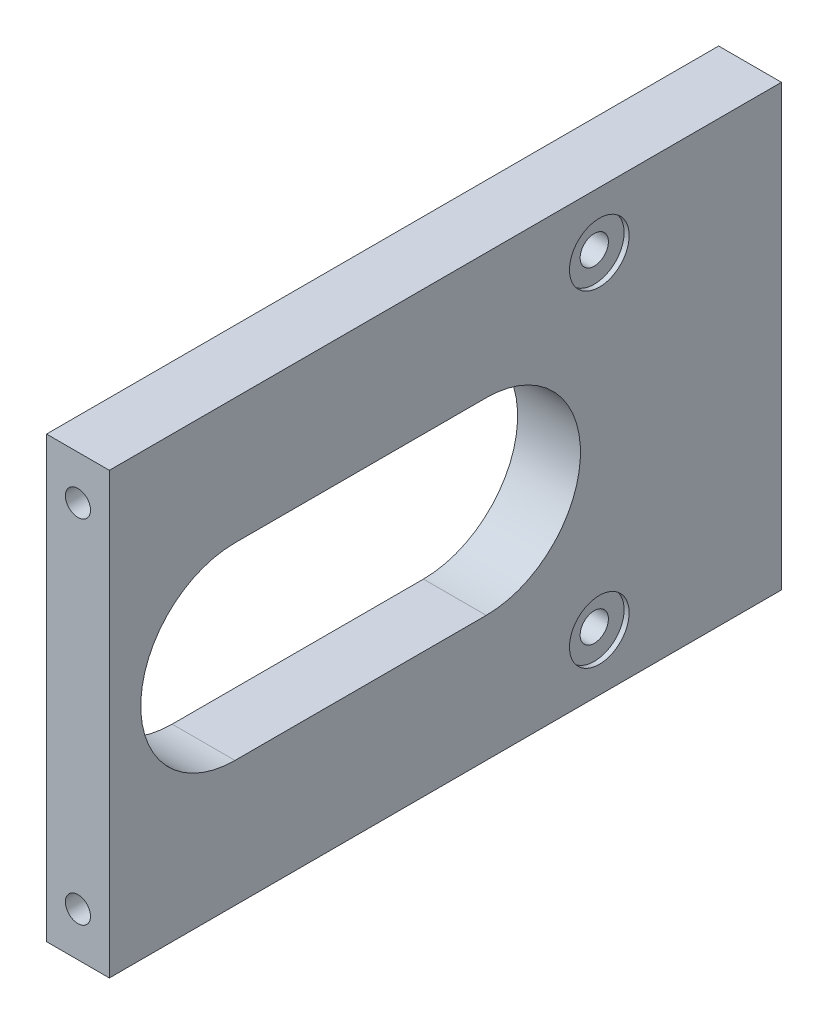
ISO-10303-21;
HEADER;
FILE_DESCRIPTION(('STEP AP214'),'2;1');
FILE_NAME('part.step','',(''),(''),'','','');
FILE_SCHEMA(('AUTOMOTIVE_DESIGN { 1 0 10303 214 1 1 1 1 }'));
ENDSEC;
DATA;
#1=APPLICATION_CONTEXT('core data for automotive mechanical design processes');
#2=APPLICATION_PROTOCOL_DEFINITION('international standard','automotive_design',2000,#1);
#3=PRODUCT_CONTEXT('',#1,'mechanical');
#4=PRODUCT('Part','Part','',(#3));
#5=PRODUCT_RELATED_PRODUCT_CATEGORY('part','',(#4));
#6=PRODUCT_DEFINITION_FORMATION('','',#4);
#7=PRODUCT_DEFINITION_CONTEXT('part definition',#1,'design');
#8=PRODUCT_DEFINITION('design','',#6,#7);
#9=PRODUCT_DEFINITION_SHAPE('','',#8);
#10=(LENGTH_UNIT() NAMED_UNIT(*) SI_UNIT(.MILLI.,.METRE.));
#11=(NAMED_UNIT(*) PLANE_ANGLE_UNIT() SI_UNIT($,.RADIAN.));
#12=(NAMED_UNIT(*) SI_UNIT($,.STERADIAN.) SOLID_ANGLE_UNIT());
#13=UNCERTAINTY_MEASURE_WITH_UNIT(LENGTH_MEASURE(1.E-05),#10,'distance_accuracy_value','');
#14=(GEOMETRIC_REPRESENTATION_CONTEXT(3) GLOBAL_UNCERTAINTY_ASSIGNED_CONTEXT((#13)) GLOBAL_UNIT_ASSIGNED_CONTEXT((#10,
#11,#12)) REPRESENTATION_CONTEXT('',''));
#15=CARTESIAN_POINT('',(0.,0.,0.));
#16=DIRECTION('',(0.,0.,1.));
#17=DIRECTION('',(1.,0.,0.));
#18=AXIS2_PLACEMENT_3D('',#15,#16,#17);
#19=CARTESIAN_POINT('',(5.0105,7.,12.0014));
#20=DIRECTION('',(0.,0.,1.));
#21=DIRECTION('',(1.,0.,0.));
#22=AXIS2_PLACEMENT_3D('',#19,#20,#21);
#23=PLANE('',#22);
#24=CARTESIAN_POINT('',(5.0105,7.,12.0014));
#25=DIRECTION('',(0.,0.,1.));
#26=DIRECTION('',(1.,0.,0.));
#27=AXIS2_PLACEMENT_3D('',#24,#25,#26);
#28=CIRCLE('',#27,2.);
#29=CARTESIAN_POINT('',(7.0105,7.,12.0014));
#30=VERTEX_POINT('',#29);
#31=EDGE_CURVE('E19',#30,#30,#28,.F.);
#32=ORIENTED_EDGE('',*,*,#31,.T.);
#33=EDGE_LOOP('',(#32));
#34=FACE_BOUND('',#33,.T.);
#35=ADVANCED_FACE('F16',(#34),#23,.F.);
#36=CARTESIAN_POINT('',(5.0105,63.,12.0014));
#37=DIRECTION('',(0.,0.,1.));
#38=DIRECTION('',(1.,0.,0.));
#39=AXIS2_PLACEMENT_3D('',#36,#37,#38);
#40=PLANE('',#39);
#41=CARTESIAN_POINT('',(5.0105,63.,12.0014));
#42=DIRECTION('',(0.,0.,1.));
#43=DIRECTION('',(1.,0.,0.));
#44=AXIS2_PLACEMENT_3D('',#41,#42,#43);
#45=CIRCLE('',#44,2.);
#46=CARTESIAN_POINT('',(7.0105,63.,12.0014));
#47=VERTEX_POINT('',#46);
#48=EDGE_CURVE('E170',#47,#47,#45,.F.);
#49=ORIENTED_EDGE('',*,*,#48,.T.);
#50=EDGE_LOOP('',(#49));
#51=FACE_BOUND('',#50,.T.);
#52=ADVANCED_FACE('F265',(#51),#40,.F.);
#53=CARTESIAN_POINT('',(5.0105,7.,95.0014));
#54=DIRECTION('',(0.,0.,-1.));
#55=DIRECTION('',(-1.,0.,0.));
#56=AXIS2_PLACEMENT_3D('',#53,#54,#55);
#57=PLANE('',#56);
#58=CARTESIAN_POINT('',(5.0105,7.,95.0014));
#59=DIRECTION('',(0.,0.,-1.));
#60=DIRECTION('',(-1.,0.,0.));
#61=AXIS2_PLACEMENT_3D('',#58,#59,#60);
#62=CIRCLE('',#61,2.);
#63=CARTESIAN_POINT('',(3.0105,7.,95.0014));
#64=VERTEX_POINT('',#63);
#65=EDGE_CURVE('E168',#64,#64,#62,.F.);
#66=ORIENTED_EDGE('',*,*,#65,.T.);
#67=EDGE_LOOP('',(#66));
#68=FACE_BOUND('',#67,.T.);
#69=ADVANCED_FACE('F262',(#68),#57,.F.);
#70=CARTESIAN_POINT('',(5.0105,63.,95.0014));
#71=DIRECTION('',(0.,0.,-1.));
#72=DIRECTION('',(-1.,0.,0.));
#73=AXIS2_PLACEMENT_3D('',#70,#71,#72);
#74=PLANE('',#73);
#75=CARTESIAN_POINT('',(5.0105,63.,95.0014));
#76=DIRECTION('',(0.,0.,-1.));
#77=DIRECTION('',(-1.,0.,0.));
#78=AXIS2_PLACEMENT_3D('',#75,#76,#77);
#79=CIRCLE('',#78,2.);
#80=CARTESIAN_POINT('',(3.0105,63.,95.0014));
#81=VERTEX_POINT('',#80);
#82=EDGE_CURVE('E165',#81,#81,#79,.F.);
#83=ORIENTED_EDGE('',*,*,#82,.T.);
#84=EDGE_LOOP('',(#83));
#85=FACE_BOUND('',#84,.T.);
#86=ADVANCED_FACE('F264',(#85),#74,.F.);
#87=CARTESIAN_POINT('',(9.2105,9.,29.0014));
#88=DIRECTION('',(1.,0.,0.));
#89=DIRECTION('',(0.,0.,-1.));
#90=AXIS2_PLACEMENT_3D('',#87,#88,#89);
#91=CYLINDRICAL_SURFACE('',#90,4.75);
#92=CARTESIAN_POINT('',(9.2105,9.,29.0014));
#93=DIRECTION('',(1.,0.,0.));
#94=DIRECTION('',(0.,0.,-1.));
#95=AXIS2_PLACEMENT_3D('',#92,#93,#94);
#96=CIRCLE('',#95,4.75);
#97=CARTESIAN_POINT('',(9.2105,9.,24.2514));
#98=VERTEX_POINT('',#97);
#99=EDGE_CURVE('E162',#98,#98,#96,.T.);
#100=ORIENTED_EDGE('',*,*,#99,.F.);
#101=EDGE_LOOP('',(#100));
#102=FACE_BOUND('',#101,.T.);
#103=CARTESIAN_POINT('',(10.0105,9.,29.0014));
#104=DIRECTION('',(1.,0.,0.));
#105=DIRECTION('',(0.,0.,-1.));
#106=AXIS2_PLACEMENT_3D('',#103,#104,#105);
#107=CIRCLE('',#106,4.75);
#108=CARTESIAN_POINT('',(10.0105,9.,24.2514));
#109=VERTEX_POINT('',#108);
#110=EDGE_CURVE('E156',#109,#109,#107,.F.);
#111=ORIENTED_EDGE('',*,*,#110,.F.);
#112=EDGE_LOOP('',(#111));
#113=FACE_BOUND('',#112,.T.);
#114=ADVANCED_FACE('F192',(#102,#113),#91,.F.);
#115=CARTESIAN_POINT('',(9.2105,61.,29.0014));
#116=DIRECTION('',(1.,0.,0.));
#117=DIRECTION('',(0.,0.,-1.));
#118=AXIS2_PLACEMENT_3D('',#115,#116,#117);
#119=CYLINDRICAL_SURFACE('',#118,4.75);
#120=CARTESIAN_POINT('',(9.2105,61.,29.0014));
#121=DIRECTION('',(1.,0.,0.));
#122=DIRECTION('',(0.,0.,-1.));
#123=AXIS2_PLACEMENT_3D('',#120,#121,#122);
#124=CIRCLE('',#123,4.75);
#125=CARTESIAN_POINT('',(9.2105,61.,24.2514));
#126=VERTEX_POINT('',#125);
#127=EDGE_CURVE('E159',#126,#126,#124,.T.);
#128=ORIENTED_EDGE('',*,*,#127,.F.);
#129=EDGE_LOOP('',(#128));
#130=FACE_BOUND('',#129,.T.);
#131=CARTESIAN_POINT('',(10.0105,61.,29.0014));
#132=DIRECTION('',(1.,0.,0.));
#133=DIRECTION('',(0.,0.,-1.));
#134=AXIS2_PLACEMENT_3D('',#131,#132,#133);
#135=CIRCLE('',#134,4.75);
#136=CARTESIAN_POINT('',(10.0105,61.,24.2514));
#137=VERTEX_POINT('',#136);
#138=EDGE_CURVE('E98',#137,#137,#135,.F.);
#139=ORIENTED_EDGE('',*,*,#138,.F.);
#140=EDGE_LOOP('',(#139));
#141=FACE_BOUND('',#140,.T.);
#142=ADVANCED_FACE('F181',(#130,#141),#119,.F.);
#143=CARTESIAN_POINT('',(5.0105,7.,0.001400000000103));
#144=DIRECTION('',(0.,0.,1.));
#145=DIRECTION('',(1.,0.,0.));
#146=AXIS2_PLACEMENT_3D('',#143,#144,#145);
#147=CYLINDRICAL_SURFACE('',#146,2.);
#148=CARTESIAN_POINT('',(5.0105,7.,0.001400000000103));
#149=DIRECTION('',(0.,0.,1.));
#150=DIRECTION('',(1.,0.,0.));
#151=AXIS2_PLACEMENT_3D('',#148,#149,#150);
#152=CIRCLE('',#151,2.);
#153=CARTESIAN_POINT('',(7.0105,7.,0.001400000000103));
#154=VERTEX_POINT('',#153);
#155=EDGE_CURVE('E106',#154,#154,#152,.F.);
#156=ORIENTED_EDGE('',*,*,#155,.T.);
#157=EDGE_LOOP('',(#156));
#158=FACE_BOUND('',#157,.T.);
#159=ORIENTED_EDGE('',*,*,#31,.F.);
#160=EDGE_LOOP('',(#159));
#161=FACE_BOUND('',#160,.T.);
#162=ADVANCED_FACE('F178',(#158,#161),#147,.F.);
#163=CARTESIAN_POINT('',(5.0105,63.,0.001400000000103));
#164=DIRECTION('',(0.,0.,1.));
#165=DIRECTION('',(1.,0.,0.));
#166=AXIS2_PLACEMENT_3D('',#163,#164,#165);
#167=CYLINDRICAL_SURFACE('',#166,2.);
#168=CARTESIAN_POINT('',(5.0105,63.,0.001400000000103));
#169=DIRECTION('',(0.,0.,1.));
#170=DIRECTION('',(1.,0.,0.));
#171=AXIS2_PLACEMENT_3D('',#168,#169,#170);
#172=CIRCLE('',#171,2.);
#173=CARTESIAN_POINT('',(7.0105,63.,0.001400000000103));
#174=VERTEX_POINT('',#173);
#175=EDGE_CURVE('E149',#174,#174,#172,.F.);
#176=ORIENTED_EDGE('',*,*,#175,.T.);
#177=EDGE_LOOP('',(#176));
#178=FACE_BOUND('',#177,.T.);
#179=ORIENTED_EDGE('',*,*,#48,.F.);
#180=EDGE_LOOP('',(#179));
#181=FACE_BOUND('',#180,.T.);
#182=ADVANCED_FACE('F180',(#178,#181),#167,.F.);
#183=CARTESIAN_POINT('',(5.0105,7.,107.0014));
#184=DIRECTION('',(0.,0.,-1.));
#185=DIRECTION('',(-1.,0.,0.));
#186=AXIS2_PLACEMENT_3D('',#183,#184,#185);
#187=CYLINDRICAL_SURFACE('',#186,2.);
#188=CARTESIAN_POINT('',(5.0105,7.,107.0014));
#189=DIRECTION('',(0.,0.,-1.));
#190=DIRECTION('',(-1.,0.,0.));
#191=AXIS2_PLACEMENT_3D('',#188,#189,#190);
#192=CIRCLE('',#191,2.);
#193=CARTESIAN_POINT('',(3.0105,7.,107.0014));
#194=VERTEX_POINT('',#193);
#195=EDGE_CURVE('E145',#194,#194,#192,.T.);
#196=ORIENTED_EDGE('',*,*,#195,.F.);
#197=EDGE_LOOP('',(#196));
#198=FACE_BOUND('',#197,.T.);
#199=ORIENTED_EDGE('',*,*,#65,.F.);
#200=EDGE_LOOP('',(#199));
#201=FACE_BOUND('',#200,.T.);
#202=ADVANCED_FACE('F189',(#198,#201),#187,.F.);
#203=CARTESIAN_POINT('',(5.0105,63.,107.0014));
#204=DIRECTION('',(0.,0.,-1.));
#205=DIRECTION('',(-1.,0.,0.));
#206=AXIS2_PLACEMENT_3D('',#203,#204,#205);
#207=CYLINDRICAL_SURFACE('',#206,2.);
#208=CARTESIAN_POINT('',(5.0105,63.,107.0014));
#209=DIRECTION('',(0.,0.,-1.));
#210=DIRECTION('',(-1.,0.,0.));
#211=AXIS2_PLACEMENT_3D('',#208,#209,#210);
#212=CIRCLE('',#211,2.);
#213=CARTESIAN_POINT('',(3.0105,63.,107.0014));
#214=VERTEX_POINT('',#213);
#215=EDGE_CURVE('E142',#214,#214,#212,.T.);
#216=ORIENTED_EDGE('',*,*,#215,.F.);
#217=EDGE_LOOP('',(#216));
#218=FACE_BOUND('',#217,.T.);
#219=ORIENTED_EDGE('',*,*,#82,.F.);
#220=EDGE_LOOP('',(#219));
#221=FACE_BOUND('',#220,.T.);
#222=ADVANCED_FACE('F249',(#218,#221),#207,.F.);
#223=CARTESIAN_POINT('',(9.2105,9.,29.0014));
#224=DIRECTION('',(1.,0.,0.));
#225=DIRECTION('',(0.,0.,-1.));
#226=AXIS2_PLACEMENT_3D('',#223,#224,#225);
#227=PLANE('',#226);
#228=CARTESIAN_POINT('',(9.2105,9.,29.0014));
#229=DIRECTION('',(1.,0.,0.));
#230=DIRECTION('',(0.,0.,-1.));
#231=AXIS2_PLACEMENT_3D('',#228,#229,#230);
#232=CIRCLE('',#231,2.25);
#233=CARTESIAN_POINT('',(9.2105,9.,26.7514));
#234=VERTEX_POINT('',#233);
#235=EDGE_CURVE('E139',#234,#234,#232,.F.);
#236=ORIENTED_EDGE('',*,*,#235,.T.);
#237=EDGE_LOOP('',(#236));
#238=FACE_BOUND('',#237,.T.);
#239=ORIENTED_EDGE('',*,*,#99,.T.);
#240=EDGE_LOOP('',(#239));
#241=FACE_BOUND('',#240,.T.);
#242=ADVANCED_FACE('F245',(#238,#241),#227,.T.);
#243=CARTESIAN_POINT('',(9.2105,61.,29.0014));
#244=DIRECTION('',(1.,0.,0.));
#245=DIRECTION('',(0.,0.,-1.));
#246=AXIS2_PLACEMENT_3D('',#243,#244,#245);
#247=PLANE('',#246);
#248=CARTESIAN_POINT('',(9.2105,61.,29.0014));
#249=DIRECTION('',(1.,0.,0.));
#250=DIRECTION('',(0.,0.,-1.));
#251=AXIS2_PLACEMENT_3D('',#248,#249,#250);
#252=CIRCLE('',#251,2.25);
#253=CARTESIAN_POINT('',(9.2105,61.,26.7514));
#254=VERTEX_POINT('',#253);
#255=EDGE_CURVE('E136',#254,#254,#252,.F.);
#256=ORIENTED_EDGE('',*,*,#255,.T.);
#257=EDGE_LOOP('',(#256));
#258=FACE_BOUND('',#257,.T.);
#259=ORIENTED_EDGE('',*,*,#127,.T.);
#260=EDGE_LOOP('',(#259));
#261=FACE_BOUND('',#260,.T.);
#262=ADVANCED_FACE('F241',(#258,#261),#247,.T.);
#263=CARTESIAN_POINT('',(10.0105,0.,0.001400000000103));
#264=DIRECTION('',(1.,0.,0.));
#265=DIRECTION('',(0.,0.,-1.));
#266=AXIS2_PLACEMENT_3D('',#263,#264,#265);
#267=PLANE('',#266);
#268=CARTESIAN_POINT('',(10.0105,35.,87.0014));
#269=DIRECTION('',(-1.,0.,0.));
#270=DIRECTION('',(0.,0.,1.));
#271=AXIS2_PLACEMENT_3D('',#268,#269,#270);
#272=CIRCLE('',#271,15.);
#273=CARTESIAN_POINT('',(10.0105,20.,87.0014));
#274=VERTEX_POINT('',#273);
#275=CARTESIAN_POINT('',(10.0105,50.,87.0014));
#276=VERTEX_POINT('',#275);
#277=EDGE_CURVE('E133',#274,#276,#272,.T.);
#278=ORIENTED_EDGE('',*,*,#277,.T.);
#279=DIRECTION('',(0.,0.,1.));
#280=VECTOR('',#279,1.);
#281=CARTESIAN_POINT('',(10.0105,50.,87.0014));
#282=LINE('',#281,#280);
#283=CARTESIAN_POINT('',(10.0105,50.,47.0014));
#284=VERTEX_POINT('',#283);
#285=EDGE_CURVE('E112',#276,#284,#282,.F.);
#286=ORIENTED_EDGE('',*,*,#285,.T.);
#287=CARTESIAN_POINT('',(10.0105,35.,47.0014));
#288=DIRECTION('',(-1.,0.,0.));
#289=DIRECTION('',(0.,0.,1.));
#290=AXIS2_PLACEMENT_3D('',#287,#288,#289);
#291=CIRCLE('',#290,15.);
#292=CARTESIAN_POINT('',(10.0105,20.,47.0014));
#293=VERTEX_POINT('',#292);
#294=EDGE_CURVE('E58',#284,#293,#291,.T.);
#295=ORIENTED_EDGE('',*,*,#294,.T.);
#296=DIRECTION('',(0.,0.,-1.));
#297=VECTOR('',#296,1.);
#298=CARTESIAN_POINT('',(10.0105,20.,47.0014));
#299=LINE('',#298,#297);
#300=EDGE_CURVE('E116',#293,#274,#299,.F.);
#301=ORIENTED_EDGE('',*,*,#300,.T.);
#302=EDGE_LOOP('',(#278,#286,#295,#301));
#303=FACE_BOUND('',#302,.T.);
#304=ORIENTED_EDGE('',*,*,#138,.T.);
#305=EDGE_LOOP('',(#304));
#306=FACE_BOUND('',#305,.T.);
#307=ORIENTED_EDGE('',*,*,#110,.T.);
#308=EDGE_LOOP('',(#307));
#309=FACE_BOUND('',#308,.T.);
#310=DIRECTION('',(0.,0.,1.));
#311=VECTOR('',#310,1.);
#312=CARTESIAN_POINT('',(10.0105,70.,0.001400000000103));
#313=LINE('',#312,#311);
#314=CARTESIAN_POINT('',(10.0105,70.,107.0014));
#315=VERTEX_POINT('',#314);
#316=CARTESIAN_POINT('',(10.0105,70.,0.001400000000103));
#317=VERTEX_POINT('',#316);
#318=EDGE_CURVE('E434',#315,#317,#313,.F.);
#319=ORIENTED_EDGE('',*,*,#318,.F.);
#320=DIRECTION('',(0.,1.,0.));
#321=VECTOR('',#320,1.);
#322=CARTESIAN_POINT('',(10.0105,0.,107.0014));
#323=LINE('',#322,#321);
#324=CARTESIAN_POINT('',(10.0105,0.,107.0014));
#325=VERTEX_POINT('',#324);
#326=EDGE_CURVE('E93',#325,#315,#323,.T.);
#327=ORIENTED_EDGE('',*,*,#326,.F.);
#328=DIRECTION('',(0.,0.,1.));
#329=VECTOR('',#328,1.);
#330=CARTESIAN_POINT('',(10.0105,0.,0.001400000000103));
#331=LINE('',#330,#329);
#332=CARTESIAN_POINT('',(10.0105,0.,0.001400000000103));
#333=VERTEX_POINT('',#332);
#334=EDGE_CURVE('E87',#325,#333,#331,.F.);
#335=ORIENTED_EDGE('',*,*,#334,.T.);
#336=DIRECTION('',(0.,1.,0.));
#337=VECTOR('',#336,1.);
#338=CARTESIAN_POINT('',(10.0105,0.,0.001400000000103));
#339=LINE('',#338,#337);
#340=EDGE_CURVE('E91',#333,#317,#339,.T.);
#341=ORIENTED_EDGE('',*,*,#340,.T.);
#342=EDGE_LOOP('',(#319,#327,#335,#341));
#343=FACE_BOUND('',#342,.T.);
#344=ADVANCED_FACE('F90',(#303,#306,#309,#343),#267,.T.);
#345=CARTESIAN_POINT('',(0.01049999999998,0.,0.001400000000103));
#346=DIRECTION('',(0.,1.,0.));
#347=DIRECTION('',(0.,0.,1.));
#348=AXIS2_PLACEMENT_3D('',#345,#346,#347);
#349=PLANE('',#348);
#350=DIRECTION('',(1.,0.,0.));
#351=VECTOR('',#350,1.);
#352=CARTESIAN_POINT('',(0.01049999999998,0.,107.0014));
#353=LINE('',#352,#351);
#354=CARTESIAN_POINT('',(0.01049999999998,0.,107.0014));
#355=VERTEX_POINT('',#354);
#356=EDGE_CURVE('E432',#355,#325,#353,.T.);
#357=ORIENTED_EDGE('',*,*,#356,.F.);
#358=DIRECTION('',(0.,0.,-1.));
#359=VECTOR('',#358,1.);
#360=CARTESIAN_POINT('',(0.01049999999998,0.,0.001400000000103));
#361=LINE('',#360,#359);
#362=CARTESIAN_POINT('',(0.01049999999998,0.,0.001400000000103));
#363=VERTEX_POINT('',#362);
#364=EDGE_CURVE('E67',#355,#363,#361,.T.);
#365=ORIENTED_EDGE('',*,*,#364,.T.);
#366=DIRECTION('',(1.,0.,0.));
#367=VECTOR('',#366,1.);
#368=CARTESIAN_POINT('',(0.01049999999998,0.,0.001400000000103));
#369=LINE('',#368,#367);
#370=EDGE_CURVE('E97',#363,#333,#369,.T.);
#371=ORIENTED_EDGE('',*,*,#370,.T.);
#372=ORIENTED_EDGE('',*,*,#334,.F.);
#373=EDGE_LOOP('',(#357,#365,#371,#372));
#374=FACE_BOUND('',#373,.T.);
#375=ADVANCED_FACE('F108',(#374),#349,.F.);
#376=CARTESIAN_POINT('',(0.01049999999998,0.,0.001400000000103));
#377=DIRECTION('',(0.,0.,1.));
#378=DIRECTION('',(1.,0.,0.));
#379=AXIS2_PLACEMENT_3D('',#376,#377,#378);
#380=PLANE('',#379);
#381=ORIENTED_EDGE('',*,*,#175,.F.);
#382=EDGE_LOOP('',(#381));
#383=FACE_BOUND('',#382,.T.);
#384=ORIENTED_EDGE('',*,*,#155,.F.);
#385=EDGE_LOOP('',(#384));
#386=FACE_BOUND('',#385,.T.);
#387=ORIENTED_EDGE('',*,*,#340,.F.);
#388=ORIENTED_EDGE('',*,*,#370,.F.);
#389=DIRECTION('',(0.,1.,0.));
#390=VECTOR('',#389,1.);
#391=CARTESIAN_POINT('',(0.01049999999998,0.,0.001400000000103));
#392=LINE('',#391,#390);
#393=CARTESIAN_POINT('',(0.01049999999998,70.,0.001400000000103));
#394=VERTEX_POINT('',#393);
#395=EDGE_CURVE('E443',#363,#394,#392,.T.);
#396=ORIENTED_EDGE('',*,*,#395,.T.);
#397=DIRECTION('',(1.,0.,0.));
#398=VECTOR('',#397,1.);
#399=CARTESIAN_POINT('',(0.01049999999998,70.,0.001400000000103));
#400=LINE('',#399,#398);
#401=EDGE_CURVE('E105',#317,#394,#400,.F.);
#402=ORIENTED_EDGE('',*,*,#401,.F.);
#403=EDGE_LOOP('',(#387,#388,#396,#402));
#404=FACE_BOUND('',#403,.T.);
#405=ADVANCED_FACE('F102',(#383,#386,#404),#380,.F.);
#406=CARTESIAN_POINT('',(0.01049999999998,70.,0.001400000000103));
#407=DIRECTION('',(0.,1.,0.));
#408=DIRECTION('',(0.,0.,1.));
#409=AXIS2_PLACEMENT_3D('',#406,#407,#408);
#410=PLANE('',#409);
#411=DIRECTION('',(1.,0.,0.));
#412=VECTOR('',#411,1.);
#413=CARTESIAN_POINT('',(0.01049999999998,70.,107.0014));
#414=LINE('',#413,#412);
#415=CARTESIAN_POINT('',(0.01049999999998,70.,107.0014));
#416=VERTEX_POINT('',#415);
#417=EDGE_CURVE('E148',#315,#416,#414,.F.);
#418=ORIENTED_EDGE('',*,*,#417,.F.);
#419=ORIENTED_EDGE('',*,*,#318,.T.);
#420=ORIENTED_EDGE('',*,*,#401,.T.);
#421=DIRECTION('',(0.,0.,-1.));
#422=VECTOR('',#421,1.);
#423=CARTESIAN_POINT('',(0.01049999999998,70.,0.001400000000103));
#424=LINE('',#423,#422);
#425=EDGE_CURVE('E438',#394,#416,#424,.F.);
#426=ORIENTED_EDGE('',*,*,#425,.T.);
#427=EDGE_LOOP('',(#418,#419,#420,#426));
#428=FACE_BOUND('',#427,.T.);
#429=ADVANCED_FACE('F229',(#428),#410,.T.);
#430=CARTESIAN_POINT('',(0.01049999999998,0.,107.0014));
#431=DIRECTION('',(0.,0.,1.));
#432=DIRECTION('',(1.,0.,0.));
#433=AXIS2_PLACEMENT_3D('',#430,#431,#432);
#434=PLANE('',#433);
#435=ORIENTED_EDGE('',*,*,#215,.T.);
#436=EDGE_LOOP('',(#435));
#437=FACE_BOUND('',#436,.T.);
#438=ORIENTED_EDGE('',*,*,#195,.T.);
#439=EDGE_LOOP('',(#438));
#440=FACE_BOUND('',#439,.T.);
#441=ORIENTED_EDGE('',*,*,#326,.T.);
#442=ORIENTED_EDGE('',*,*,#417,.T.);
#443=DIRECTION('',(0.,1.,0.));
#444=VECTOR('',#443,1.);
#445=CARTESIAN_POINT('',(0.01049999999998,0.,107.0014));
#446=LINE('',#445,#444);
#447=EDGE_CURVE('E132',#416,#355,#446,.F.);
#448=ORIENTED_EDGE('',*,*,#447,.T.);
#449=ORIENTED_EDGE('',*,*,#356,.T.);
#450=EDGE_LOOP('',(#441,#442,#448,#449));
#451=FACE_BOUND('',#450,.T.);
#452=ADVANCED_FACE('F225',(#437,#440,#451),#434,.T.);
#453=CARTESIAN_POINT('',(0.01049999999998,9.,29.0014));
#454=DIRECTION('',(1.,0.,0.));
#455=DIRECTION('',(0.,0.,-1.));
#456=AXIS2_PLACEMENT_3D('',#453,#454,#455);
#457=CYLINDRICAL_SURFACE('',#456,2.25);
#458=CARTESIAN_POINT('',(0.01049999999998,9.,29.0014));
#459=DIRECTION('',(1.,0.,0.));
#460=DIRECTION('',(0.,0.,-1.));
#461=AXIS2_PLACEMENT_3D('',#458,#459,#460);
#462=CIRCLE('',#461,2.25);
#463=CARTESIAN_POINT('',(0.01049999999998,9.,26.7514));
#464=VERTEX_POINT('',#463);
#465=EDGE_CURVE('E129',#464,#464,#462,.F.);
#466=ORIENTED_EDGE('',*,*,#465,.T.);
#467=EDGE_LOOP('',(#466));
#468=FACE_BOUND('',#467,.T.);
#469=ORIENTED_EDGE('',*,*,#235,.F.);
#470=EDGE_LOOP('',(#469));
#471=FACE_BOUND('',#470,.T.);
#472=ADVANCED_FACE('F221',(#468,#471),#457,.F.);
#473=CARTESIAN_POINT('',(0.01049999999998,61.,29.0014));
#474=DIRECTION('',(1.,0.,0.));
#475=DIRECTION('',(0.,0.,-1.));
#476=AXIS2_PLACEMENT_3D('',#473,#474,#475);
#477=CYLINDRICAL_SURFACE('',#476,2.25);
#478=CARTESIAN_POINT('',(0.01049999999998,61.,29.0014));
#479=DIRECTION('',(1.,0.,0.));
#480=DIRECTION('',(0.,0.,-1.));
#481=AXIS2_PLACEMENT_3D('',#478,#479,#480);
#482=CIRCLE('',#481,2.25);
#483=CARTESIAN_POINT('',(0.01049999999998,61.,26.7514));
#484=VERTEX_POINT('',#483);
#485=EDGE_CURVE('E126',#484,#484,#482,.F.);
#486=ORIENTED_EDGE('',*,*,#485,.T.);
#487=EDGE_LOOP('',(#486));
#488=FACE_BOUND('',#487,.T.);
#489=ORIENTED_EDGE('',*,*,#255,.F.);
#490=EDGE_LOOP('',(#489));
#491=FACE_BOUND('',#490,.T.);
#492=ADVANCED_FACE('F218',(#488,#491),#477,.F.);
#493=CARTESIAN_POINT('',(0.01049999999998,35.,47.0014));
#494=DIRECTION('',(-1.,0.,0.));
#495=DIRECTION('',(0.,0.,1.));
#496=AXIS2_PLACEMENT_3D('',#493,#494,#495);
#497=CYLINDRICAL_SURFACE('',#496,15.);
#498=DIRECTION('',(1.,0.,0.));
#499=VECTOR('',#498,1.);
#500=CARTESIAN_POINT('',(0.01049999999998,20.,47.0014));
#501=LINE('',#500,#499);
#502=CARTESIAN_POINT('',(0.01049999999998,20.,47.0014));
#503=VERTEX_POINT('',#502);
#504=EDGE_CURVE('E119',#503,#293,#501,.T.);
#505=ORIENTED_EDGE('',*,*,#504,.T.);
#506=ORIENTED_EDGE('',*,*,#294,.F.);
#507=DIRECTION('',(1.,0.,0.));
#508=VECTOR('',#507,1.);
#509=CARTESIAN_POINT('',(0.01049999999998,50.,47.0014));
#510=LINE('',#509,#508);
#511=CARTESIAN_POINT('',(0.01049999999998,50.,47.0014));
#512=VERTEX_POINT('',#511);
#513=EDGE_CURVE('E115',#284,#512,#510,.F.);
#514=ORIENTED_EDGE('',*,*,#513,.T.);
#515=CARTESIAN_POINT('',(0.01049999999998,35.,47.0014));
#516=DIRECTION('',(-1.,0.,0.));
#517=DIRECTION('',(0.,0.,1.));
#518=AXIS2_PLACEMENT_3D('',#515,#516,#517);
#519=CIRCLE('',#518,15.);
#520=EDGE_CURVE('E123',#512,#503,#519,.T.);
#521=ORIENTED_EDGE('',*,*,#520,.T.);
#522=EDGE_LOOP('',(#505,#506,#514,#521));
#523=FACE_BOUND('',#522,.T.);
#524=ADVANCED_FACE('F214',(#523),#497,.F.);
#525=CARTESIAN_POINT('',(0.01049999999998,20.,47.0014));
#526=DIRECTION('',(0.,-1.,0.));
#527=DIRECTION('',(0.,0.,-1.));
#528=AXIS2_PLACEMENT_3D('',#525,#526,#527);
#529=PLANE('',#528);
#530=DIRECTION('',(-1.,0.,0.));
#531=VECTOR('',#530,1.);
#532=CARTESIAN_POINT('',(0.01049999999998,20.,87.0014));
#533=LINE('',#532,#531);
#534=CARTESIAN_POINT('',(0.01049999999998,20.,87.0014));
#535=VERTEX_POINT('',#534);
#536=EDGE_CURVE('E118',#535,#274,#533,.F.);
#537=ORIENTED_EDGE('',*,*,#536,.T.);
#538=ORIENTED_EDGE('',*,*,#300,.F.);
#539=ORIENTED_EDGE('',*,*,#504,.F.);
#540=DIRECTION('',(0.,0.,-1.));
#541=VECTOR('',#540,1.);
#542=CARTESIAN_POINT('',(0.01049999999998,20.,0.001400000000103));
#543=LINE('',#542,#541);
#544=EDGE_CURVE('E122',#503,#535,#543,.F.);
#545=ORIENTED_EDGE('',*,*,#544,.T.);
#546=EDGE_LOOP('',(#537,#538,#539,#545));
#547=FACE_BOUND('',#546,.T.);
#548=ADVANCED_FACE('F210',(#547),#529,.F.);
#549=CARTESIAN_POINT('',(0.01049999999998,35.,87.0014));
#550=DIRECTION('',(-1.,0.,0.));
#551=DIRECTION('',(0.,0.,1.));
#552=AXIS2_PLACEMENT_3D('',#549,#550,#551);
#553=CYLINDRICAL_SURFACE('',#552,15.);
#554=DIRECTION('',(1.,0.,0.));
#555=VECTOR('',#554,1.);
#556=CARTESIAN_POINT('',(0.01049999999998,50.,87.0014));
#557=LINE('',#556,#555);
#558=CARTESIAN_POINT('',(0.01049999999998,50.,87.0014));
#559=VERTEX_POINT('',#558);
#560=EDGE_CURVE('E33',#559,#276,#557,.T.);
#561=ORIENTED_EDGE('',*,*,#560,.T.);
#562=ORIENTED_EDGE('',*,*,#277,.F.);
#563=ORIENTED_EDGE('',*,*,#536,.F.);
#564=CARTESIAN_POINT('',(0.01049999999998,35.,87.0014));
#565=DIRECTION('',(-1.,0.,0.));
#566=DIRECTION('',(0.,0.,1.));
#567=AXIS2_PLACEMENT_3D('',#564,#565,#566);
#568=CIRCLE('',#567,15.);
#569=EDGE_CURVE('E25',#535,#559,#568,.T.);
#570=ORIENTED_EDGE('',*,*,#569,.T.);
#571=EDGE_LOOP('',(#561,#562,#563,#570));
#572=FACE_BOUND('',#571,.T.);
#573=ADVANCED_FACE('F203',(#572),#553,.F.);
#574=CARTESIAN_POINT('',(0.01049999999998,50.,87.0014));
#575=DIRECTION('',(0.,1.,0.));
#576=DIRECTION('',(0.,0.,1.));
#577=AXIS2_PLACEMENT_3D('',#574,#575,#576);
#578=PLANE('',#577);
#579=ORIENTED_EDGE('',*,*,#513,.F.);
#580=ORIENTED_EDGE('',*,*,#285,.F.);
#581=ORIENTED_EDGE('',*,*,#560,.F.);
#582=DIRECTION('',(0.,0.,-1.));
#583=VECTOR('',#582,1.);
#584=CARTESIAN_POINT('',(0.01049999999998,50.,0.001400000000103));
#585=LINE('',#584,#583);
#586=EDGE_CURVE('E11',#559,#512,#585,.T.);
#587=ORIENTED_EDGE('',*,*,#586,.T.);
#588=EDGE_LOOP('',(#579,#580,#581,#587));
#589=FACE_BOUND('',#588,.T.);
#590=ADVANCED_FACE('F197',(#589),#578,.F.);
#591=CARTESIAN_POINT('',(0.01049999999998,0.,0.001400000000103));
#592=DIRECTION('',(1.,0.,0.));
#593=DIRECTION('',(0.,0.,-1.));
#594=AXIS2_PLACEMENT_3D('',#591,#592,#593);
#595=PLANE('',#594);
#596=ORIENTED_EDGE('',*,*,#569,.F.);
#597=ORIENTED_EDGE('',*,*,#544,.F.);
#598=ORIENTED_EDGE('',*,*,#520,.F.);
#599=ORIENTED_EDGE('',*,*,#586,.F.);
#600=EDGE_LOOP('',(#596,#597,#598,#599));
#601=FACE_BOUND('',#600,.T.);
#602=ORIENTED_EDGE('',*,*,#485,.F.);
#603=EDGE_LOOP('',(#602));
#604=FACE_BOUND('',#603,.T.);
#605=ORIENTED_EDGE('',*,*,#465,.F.);
#606=EDGE_LOOP('',(#605));
#607=FACE_BOUND('',#606,.T.);
#608=ORIENTED_EDGE('',*,*,#425,.F.);
#609=ORIENTED_EDGE('',*,*,#395,.F.);
#610=ORIENTED_EDGE('',*,*,#364,.F.);
#611=ORIENTED_EDGE('',*,*,#447,.F.);
#612=EDGE_LOOP('',(#608,#609,#610,#611));
#613=FACE_BOUND('',#612,.T.);
#614=ADVANCED_FACE('F195',(#601,#604,#607,#613),#595,.F.);
#615=CLOSED_SHELL('',(#35,#52,#69,#86,#114,#142,#162,#182,#202,#222,#242,#262,#344,#375,#405,
#429,#452,#472,#492,#524,#548,#573,#590,#614));
#616=MANIFOLD_SOLID_BREP('B1',#615);
#617=ADVANCED_BREP_SHAPE_REPRESENTATION('',(#18,#616),#14);
#618=SHAPE_DEFINITION_REPRESENTATION(#9,#617);
ENDSEC;
END-ISO-10303-21;
